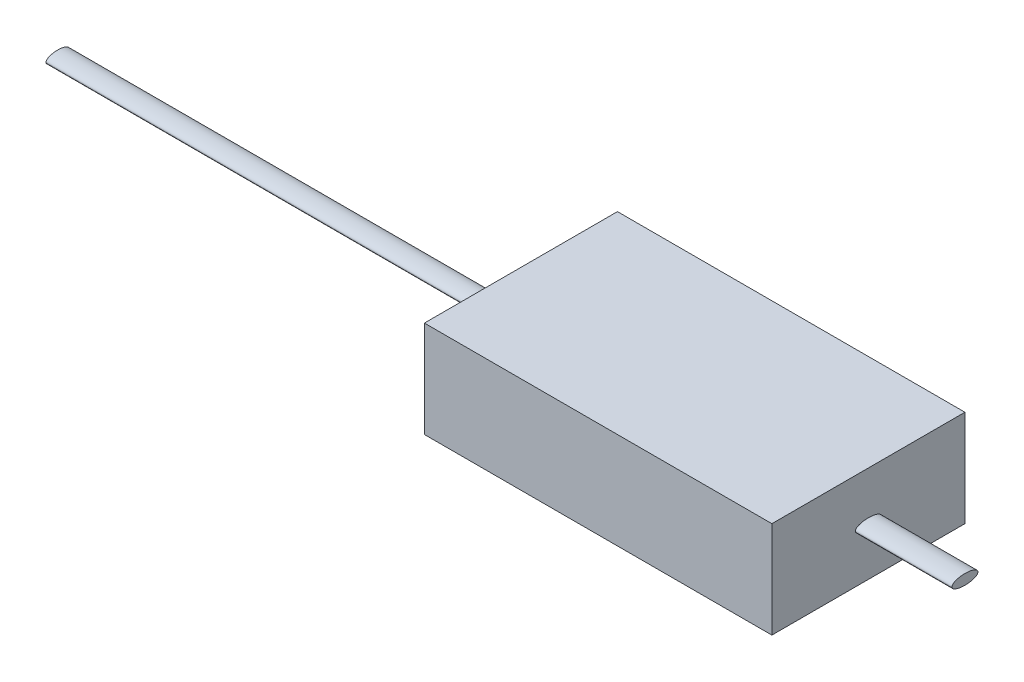
ISO-10303-21;
HEADER;
FILE_DESCRIPTION(('STEP AP214'),'2;1');
FILE_NAME('part.step','',(''),(''),'','','');
FILE_SCHEMA(('AUTOMOTIVE_DESIGN { 1 0 10303 214 1 1 1 1 }'));
ENDSEC;
DATA;
#1=APPLICATION_CONTEXT('core data for automotive mechanical design processes');
#2=APPLICATION_PROTOCOL_DEFINITION('international standard','automotive_design',2000,#1);
#3=PRODUCT_CONTEXT('',#1,'mechanical');
#4=PRODUCT('Part','Part','',(#3));
#5=PRODUCT_RELATED_PRODUCT_CATEGORY('part','',(#4));
#6=PRODUCT_DEFINITION_FORMATION('','',#4);
#7=PRODUCT_DEFINITION_CONTEXT('part definition',#1,'design');
#8=PRODUCT_DEFINITION('design','',#6,#7);
#9=PRODUCT_DEFINITION_SHAPE('','',#8);
#10=(LENGTH_UNIT() NAMED_UNIT(*) SI_UNIT(.MILLI.,.METRE.));
#11=(NAMED_UNIT(*) PLANE_ANGLE_UNIT() SI_UNIT($,.RADIAN.));
#12=(NAMED_UNIT(*) SI_UNIT($,.STERADIAN.) SOLID_ANGLE_UNIT());
#13=UNCERTAINTY_MEASURE_WITH_UNIT(LENGTH_MEASURE(1.E-05),#10,'distance_accuracy_value','');
#14=(GEOMETRIC_REPRESENTATION_CONTEXT(3) GLOBAL_UNCERTAINTY_ASSIGNED_CONTEXT((#13)) GLOBAL_UNIT_ASSIGNED_CONTEXT((#10,
#11,#12)) REPRESENTATION_CONTEXT('',''));
#15=CARTESIAN_POINT('',(0.,0.,0.));
#16=DIRECTION('',(0.,0.,1.));
#17=DIRECTION('',(1.,0.,0.));
#18=AXIS2_PLACEMENT_3D('',#15,#16,#17);
#19=CARTESIAN_POINT('',(-87.8056144767899,25.,-3.087));
#20=DIRECTION('',(1.,0.,0.));
#21=DIRECTION('',(0.,0.,-1.));
#22=AXIS2_PLACEMENT_3D('',#19,#20,#21);
#23=PLANE('',#22);
#24=CARTESIAN_POINT('',(-87.8056144767899,12.5,21.913));
#25=DIRECTION('',(-1.,0.,0.));
#26=DIRECTION('',(0.,0.,1.));
#27=AXIS2_PLACEMENT_3D('',#24,#25,#26);
#28=ELLIPSE('',#27,3.01299816637187,1.24688206801672);
#29=CARTESIAN_POINT('',(-87.8056144767899,12.5,24.9259981663719));
#30=VERTEX_POINT('',#29);
#31=EDGE_CURVE('E49',#30,#30,#28,.T.);
#32=ORIENTED_EDGE('',*,*,#31,.F.);
#33=EDGE_LOOP('',(#32));
#34=FACE_BOUND('',#33,.T.);
#35=DIRECTION('',(0.,0.,1.));
#36=VECTOR('',#35,1.);
#37=CARTESIAN_POINT('',(-87.8056144767899,0.,-3.087));
#38=LINE('',#37,#36);
#39=CARTESIAN_POINT('',(-87.8056144767899,0.,-3.087));
#40=VERTEX_POINT('',#39);
#41=CARTESIAN_POINT('',(-87.8056144767899,0.,46.913));
#42=VERTEX_POINT('',#41);
#43=EDGE_CURVE('E108',#40,#42,#38,.T.);
#44=ORIENTED_EDGE('',*,*,#43,.T.);
#45=DIRECTION('',(0.,-1.,0.));
#46=VECTOR('',#45,1.);
#47=CARTESIAN_POINT('',(-87.8056144767899,25.,46.913));
#48=LINE('',#47,#46);
#49=CARTESIAN_POINT('',(-87.8056144767899,25.,46.913));
#50=VERTEX_POINT('',#49);
#51=EDGE_CURVE('E99',#50,#42,#48,.T.);
#52=ORIENTED_EDGE('',*,*,#51,.F.);
#53=DIRECTION('',(0.,0.,1.));
#54=VECTOR('',#53,1.);
#55=CARTESIAN_POINT('',(-87.8056144767899,25.,-3.087));
#56=LINE('',#55,#54);
#57=CARTESIAN_POINT('',(-87.8056144767899,25.,-3.087));
#58=VERTEX_POINT('',#57);
#59=EDGE_CURVE('E93',#58,#50,#56,.T.);
#60=ORIENTED_EDGE('',*,*,#59,.F.);
#61=DIRECTION('',(0.,-1.,0.));
#62=VECTOR('',#61,1.);
#63=CARTESIAN_POINT('',(-87.8056144767899,25.,-3.087));
#64=LINE('',#63,#62);
#65=EDGE_CURVE('E104',#58,#40,#64,.T.);
#66=ORIENTED_EDGE('',*,*,#65,.T.);
#67=EDGE_LOOP('',(#44,#52,#60,#66));
#68=FACE_BOUND('',#67,.T.);
#69=ADVANCED_FACE('F41',(#34,#68),#23,.F.);
#70=CARTESIAN_POINT('',(-87.8056144767899,25.,46.913));
#71=DIRECTION('',(0.,0.,-1.));
#72=DIRECTION('',(-1.,0.,0.));
#73=AXIS2_PLACEMENT_3D('',#70,#71,#72);
#74=PLANE('',#73);
#75=DIRECTION('',(1.,0.,0.));
#76=VECTOR('',#75,1.);
#77=CARTESIAN_POINT('',(-87.8056144767899,0.,46.913));
#78=LINE('',#77,#76);
#79=CARTESIAN_POINT('',(2.19438552321008,0.,46.913));
#80=VERTEX_POINT('',#79);
#81=EDGE_CURVE('E98',#42,#80,#78,.T.);
#82=ORIENTED_EDGE('',*,*,#81,.T.);
#83=DIRECTION('',(0.,-1.,0.));
#84=VECTOR('',#83,1.);
#85=CARTESIAN_POINT('',(2.19438552321008,25.,46.913));
#86=LINE('',#85,#84);
#87=CARTESIAN_POINT('',(2.19438552321008,25.,46.913));
#88=VERTEX_POINT('',#87);
#89=EDGE_CURVE('E96',#88,#80,#86,.T.);
#90=ORIENTED_EDGE('',*,*,#89,.F.);
#91=DIRECTION('',(1.,0.,0.));
#92=VECTOR('',#91,1.);
#93=CARTESIAN_POINT('',(-87.8056144767899,25.,46.913));
#94=LINE('',#93,#92);
#95=EDGE_CURVE('E88',#50,#88,#94,.T.);
#96=ORIENTED_EDGE('',*,*,#95,.F.);
#97=ORIENTED_EDGE('',*,*,#51,.T.);
#98=EDGE_LOOP('',(#82,#90,#96,#97));
#99=FACE_BOUND('',#98,.T.);
#100=ADVANCED_FACE('F97',(#99),#74,.F.);
#101=CARTESIAN_POINT('',(2.19438552321008,25.,-3.087));
#102=DIRECTION('',(-1.,0.,0.));
#103=DIRECTION('',(0.,0.,1.));
#104=AXIS2_PLACEMENT_3D('',#101,#102,#103);
#105=PLANE('',#104);
#106=CARTESIAN_POINT('',(2.19438552321008,12.5,21.913));
#107=DIRECTION('',(1.,0.,0.));
#108=DIRECTION('',(0.,0.,-1.));
#109=AXIS2_PLACEMENT_3D('',#106,#107,#108);
#110=ELLIPSE('',#109,3.38695255908315,1.32783935555037);
#111=CARTESIAN_POINT('',(2.19438552321008,12.5,18.5260474409168));
#112=VERTEX_POINT('',#111);
#113=EDGE_CURVE('E11',#112,#112,#110,.T.);
#114=ORIENTED_EDGE('',*,*,#113,.F.);
#115=EDGE_LOOP('',(#114));
#116=FACE_BOUND('',#115,.T.);
#117=DIRECTION('',(0.,0.,-1.));
#118=VECTOR('',#117,1.);
#119=CARTESIAN_POINT('',(2.19438552321008,0.,-3.087));
#120=LINE('',#119,#118);
#121=CARTESIAN_POINT('',(2.19438552321008,0.,-3.087));
#122=VERTEX_POINT('',#121);
#123=EDGE_CURVE('E74',#80,#122,#120,.T.);
#124=ORIENTED_EDGE('',*,*,#123,.T.);
#125=DIRECTION('',(0.,-1.,0.));
#126=VECTOR('',#125,1.);
#127=CARTESIAN_POINT('',(2.19438552321008,25.,-3.087));
#128=LINE('',#127,#126);
#129=CARTESIAN_POINT('',(2.19438552321008,25.,-3.087));
#130=VERTEX_POINT('',#129);
#131=EDGE_CURVE('E100',#130,#122,#128,.T.);
#132=ORIENTED_EDGE('',*,*,#131,.F.);
#133=DIRECTION('',(0.,0.,-1.));
#134=VECTOR('',#133,1.);
#135=CARTESIAN_POINT('',(2.19438552321008,25.,-3.087));
#136=LINE('',#135,#134);
#137=EDGE_CURVE('E91',#88,#130,#136,.T.);
#138=ORIENTED_EDGE('',*,*,#137,.F.);
#139=ORIENTED_EDGE('',*,*,#89,.T.);
#140=EDGE_LOOP('',(#124,#132,#138,#139));
#141=FACE_BOUND('',#140,.T.);
#142=ADVANCED_FACE('F102',(#116,#141),#105,.F.);
#143=CARTESIAN_POINT('',(-87.8056144767899,25.,-3.087));
#144=DIRECTION('',(0.,0.,1.));
#145=DIRECTION('',(1.,0.,0.));
#146=AXIS2_PLACEMENT_3D('',#143,#144,#145);
#147=PLANE('',#146);
#148=DIRECTION('',(-1.,0.,0.));
#149=VECTOR('',#148,1.);
#150=CARTESIAN_POINT('',(-87.8056144767899,0.,-3.087));
#151=LINE('',#150,#149);
#152=EDGE_CURVE('E80',#122,#40,#151,.T.);
#153=ORIENTED_EDGE('',*,*,#152,.T.);
#154=ORIENTED_EDGE('',*,*,#65,.F.);
#155=DIRECTION('',(-1.,0.,0.));
#156=VECTOR('',#155,1.);
#157=CARTESIAN_POINT('',(-87.8056144767899,25.,-3.087));
#158=LINE('',#157,#156);
#159=EDGE_CURVE('E57',#130,#58,#158,.T.);
#160=ORIENTED_EDGE('',*,*,#159,.F.);
#161=ORIENTED_EDGE('',*,*,#131,.T.);
#162=EDGE_LOOP('',(#153,#154,#160,#161));
#163=FACE_BOUND('',#162,.T.);
#164=ADVANCED_FACE('F136',(#163),#147,.F.);
#165=CARTESIAN_POINT('',(0.,25.,0.));
#166=DIRECTION('',(0.,1.,0.));
#167=DIRECTION('',(0.,0.,1.));
#168=AXIS2_PLACEMENT_3D('',#165,#166,#167);
#169=PLANE('',#168);
#170=ORIENTED_EDGE('',*,*,#59,.T.);
#171=ORIENTED_EDGE('',*,*,#95,.T.);
#172=ORIENTED_EDGE('',*,*,#137,.T.);
#173=ORIENTED_EDGE('',*,*,#159,.T.);
#174=EDGE_LOOP('',(#170,#171,#172,#173));
#175=FACE_BOUND('',#174,.T.);
#176=ADVANCED_FACE('F89',(#175),#169,.T.);
#177=CARTESIAN_POINT('',(0.,0.,0.));
#178=DIRECTION('',(0.,1.,0.));
#179=DIRECTION('',(0.,0.,1.));
#180=AXIS2_PLACEMENT_3D('',#177,#178,#179);
#181=PLANE('',#180);
#182=ORIENTED_EDGE('',*,*,#43,.F.);
#183=ORIENTED_EDGE('',*,*,#152,.F.);
#184=ORIENTED_EDGE('',*,*,#123,.F.);
#185=ORIENTED_EDGE('',*,*,#81,.F.);
#186=EDGE_LOOP('',(#182,#183,#184,#185));
#187=FACE_BOUND('',#186,.T.);
#188=ADVANCED_FACE('F126',(#187),#181,.F.);
#189=CARTESIAN_POINT('',(-207.80561447679,12.5,21.913));
#190=DIRECTION('',(-1.,0.,0.));
#191=DIRECTION('',(0.,0.,1.));
#192=AXIS2_PLACEMENT_3D('',#189,#190,#191);
#193=ELLIPSE('',#192,3.01299816637187,1.24688206801672);
#194=DIRECTION('',(1.,0.,0.));
#195=VECTOR('',#194,1.);
#196=SURFACE_OF_LINEAR_EXTRUSION('',#193,#195);
#197=CARTESIAN_POINT('',(-207.80561447679,12.5,24.9259981663719));
#198=VERTEX_POINT('',#197);
#199=EDGE_CURVE('E111',#198,#198,#193,.T.);
#200=ORIENTED_EDGE('',*,*,#199,.F.);
#201=EDGE_LOOP('',(#200));
#202=FACE_BOUND('',#201,.T.);
#203=ORIENTED_EDGE('',*,*,#31,.T.);
#204=EDGE_LOOP('',(#203));
#205=FACE_BOUND('',#204,.T.);
#206=ADVANCED_FACE('F120',(#202,#205),#196,.F.);
#207=CARTESIAN_POINT('',(-207.80561447679,12.5,21.913));
#208=DIRECTION('',(-1.,0.,0.));
#209=DIRECTION('',(0.,0.,1.));
#210=AXIS2_PLACEMENT_3D('',#207,#208,#209);
#211=PLANE('',#210);
#212=ORIENTED_EDGE('',*,*,#199,.T.);
#213=EDGE_LOOP('',(#212));
#214=FACE_BOUND('',#213,.T.);
#215=ADVANCED_FACE('F133',(#214),#211,.T.);
#216=CARTESIAN_POINT('',(27.1943855232101,12.5,21.913));
#217=DIRECTION('',(1.,0.,0.));
#218=DIRECTION('',(0.,0.,-1.));
#219=AXIS2_PLACEMENT_3D('',#216,#217,#218);
#220=ELLIPSE('',#219,3.38695255908315,1.32783935555037);
#221=DIRECTION('',(-1.,0.,0.));
#222=VECTOR('',#221,1.);
#223=SURFACE_OF_LINEAR_EXTRUSION('',#220,#222);
#224=CARTESIAN_POINT('',(27.1943855232101,12.5,18.5260474409168));
#225=VERTEX_POINT('',#224);
#226=EDGE_CURVE('E211',#225,#225,#220,.T.);
#227=ORIENTED_EDGE('',*,*,#226,.F.);
#228=EDGE_LOOP('',(#227));
#229=FACE_BOUND('',#228,.T.);
#230=ORIENTED_EDGE('',*,*,#113,.T.);
#231=EDGE_LOOP('',(#230));
#232=FACE_BOUND('',#231,.T.);
#233=ADVANCED_FACE('F185',(#229,#232),#223,.F.);
#234=CARTESIAN_POINT('',(27.1943855232101,12.5,21.913));
#235=DIRECTION('',(1.,0.,0.));
#236=DIRECTION('',(0.,0.,-1.));
#237=AXIS2_PLACEMENT_3D('',#234,#235,#236);
#238=PLANE('',#237);
#239=ORIENTED_EDGE('',*,*,#226,.T.);
#240=EDGE_LOOP('',(#239));
#241=FACE_BOUND('',#240,.T.);
#242=ADVANCED_FACE('F195',(#241),#238,.T.);
#243=CLOSED_SHELL('',(#69,#100,#142,#164,#176,#188,#206,#215,#233,#242));
#244=MANIFOLD_SOLID_BREP('B2',#243);
#245=ADVANCED_BREP_SHAPE_REPRESENTATION('',(#18,#244),#14);
#246=SHAPE_DEFINITION_REPRESENTATION(#9,#245);
ENDSEC;
END-ISO-10303-21;
